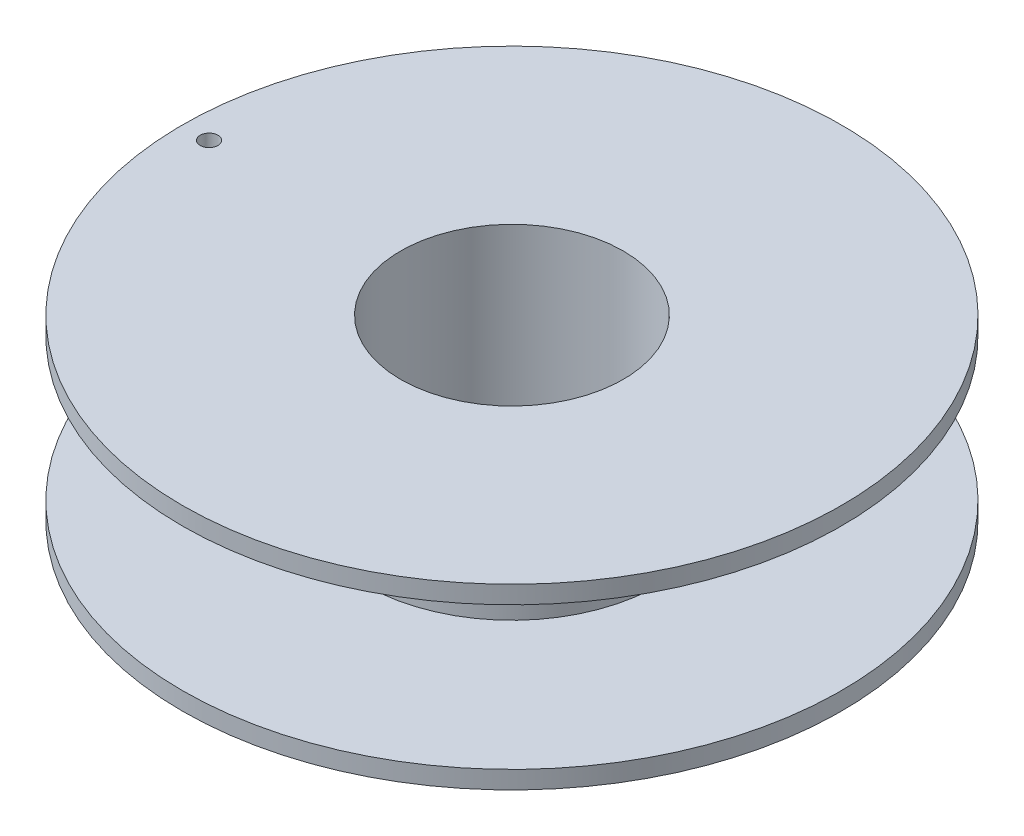
ISO-10303-21;
HEADER;
FILE_DESCRIPTION(('STEP AP214'),'2;1');
FILE_NAME('part.step','',(''),(''),'','','');
FILE_SCHEMA(('AUTOMOTIVE_DESIGN { 1 0 10303 214 1 1 1 1 }'));
ENDSEC;
DATA;
#1=APPLICATION_CONTEXT('core data for automotive mechanical design processes');
#2=APPLICATION_PROTOCOL_DEFINITION('international standard','automotive_design',2000,#1);
#3=PRODUCT_CONTEXT('',#1,'mechanical');
#4=PRODUCT('Part','Part','',(#3));
#5=PRODUCT_RELATED_PRODUCT_CATEGORY('part','',(#4));
#6=PRODUCT_DEFINITION_FORMATION('','',#4);
#7=PRODUCT_DEFINITION_CONTEXT('part definition',#1,'design');
#8=PRODUCT_DEFINITION('design','',#6,#7);
#9=PRODUCT_DEFINITION_SHAPE('','',#8);
#10=(LENGTH_UNIT() NAMED_UNIT(*) SI_UNIT(.MILLI.,.METRE.));
#11=(NAMED_UNIT(*) PLANE_ANGLE_UNIT() SI_UNIT($,.RADIAN.));
#12=(NAMED_UNIT(*) SI_UNIT($,.STERADIAN.) SOLID_ANGLE_UNIT());
#13=UNCERTAINTY_MEASURE_WITH_UNIT(LENGTH_MEASURE(1.E-05),#10,'distance_accuracy_value','');
#14=(GEOMETRIC_REPRESENTATION_CONTEXT(3) GLOBAL_UNCERTAINTY_ASSIGNED_CONTEXT((#13)) GLOBAL_UNIT_ASSIGNED_CONTEXT((#10,
#11,#12)) REPRESENTATION_CONTEXT('',''));
#15=CARTESIAN_POINT('',(0.,0.,0.));
#16=DIRECTION('',(0.,0.,1.));
#17=DIRECTION('',(1.,0.,0.));
#18=AXIS2_PLACEMENT_3D('',#15,#16,#17);
#19=CARTESIAN_POINT('',(0.,5.,0.));
#20=DIRECTION('',(0.,-1.,0.));
#21=DIRECTION('',(0.,0.,-1.));
#22=AXIS2_PLACEMENT_3D('',#19,#20,#21);
#23=CYLINDRICAL_SURFACE('',#22,18.5);
#24=CARTESIAN_POINT('',(0.,-5.,0.));
#25=DIRECTION('',(0.,1.,0.));
#26=DIRECTION('',(0.,0.,1.));
#27=AXIS2_PLACEMENT_3D('',#24,#25,#26);
#28=CIRCLE('',#27,18.5);
#29=CARTESIAN_POINT('',(0.,-5.,18.5));
#30=VERTEX_POINT('',#29);
#31=EDGE_CURVE('E71',#30,#30,#28,.T.);
#32=ORIENTED_EDGE('',*,*,#31,.T.);
#33=EDGE_LOOP('',(#32));
#34=FACE_BOUND('',#33,.T.);
#35=CARTESIAN_POINT('',(0.,-4.,0.));
#36=DIRECTION('',(0.,1.,0.));
#37=DIRECTION('',(0.,0.,1.));
#38=AXIS2_PLACEMENT_3D('',#35,#36,#37);
#39=CIRCLE('',#38,18.5);
#40=CARTESIAN_POINT('',(0.,-4.,18.5));
#41=VERTEX_POINT('',#40);
#42=EDGE_CURVE('E75',#41,#41,#39,.T.);
#43=ORIENTED_EDGE('',*,*,#42,.F.);
#44=EDGE_LOOP('',(#43));
#45=FACE_BOUND('',#44,.T.);
#46=ADVANCED_FACE('F49',(#34,#45),#23,.T.);
#47=CARTESIAN_POINT('',(0.,5.,0.));
#48=DIRECTION('',(0.,1.,0.));
#49=DIRECTION('',(0.,0.,1.));
#50=AXIS2_PLACEMENT_3D('',#47,#48,#49);
#51=PLANE('',#50);
#52=CARTESIAN_POINT('',(-17.,5.,0.));
#53=DIRECTION('',(0.,1.,0.));
#54=DIRECTION('',(0.,0.,1.));
#55=AXIS2_PLACEMENT_3D('',#52,#53,#54);
#56=CIRCLE('',#55,0.499999999999999);
#57=CARTESIAN_POINT('',(-17.,5.,0.499999999999999));
#58=VERTEX_POINT('',#57);
#59=EDGE_CURVE('E210',#58,#58,#56,.T.);
#60=ORIENTED_EDGE('',*,*,#59,.F.);
#61=EDGE_LOOP('',(#60));
#62=FACE_BOUND('',#61,.T.);
#63=CARTESIAN_POINT('',(0.,5.,0.));
#64=DIRECTION('',(0.,1.,0.));
#65=DIRECTION('',(0.,0.,1.));
#66=AXIS2_PLACEMENT_3D('',#63,#64,#65);
#67=CIRCLE('',#66,6.25);
#68=CARTESIAN_POINT('',(0.,5.,6.25));
#69=VERTEX_POINT('',#68);
#70=EDGE_CURVE('E11',#69,#69,#67,.T.);
#71=ORIENTED_EDGE('',*,*,#70,.F.);
#72=EDGE_LOOP('',(#71));
#73=FACE_BOUND('',#72,.T.);
#74=CARTESIAN_POINT('',(0.,5.,0.));
#75=DIRECTION('',(0.,1.,0.));
#76=DIRECTION('',(0.,0.,1.));
#77=AXIS2_PLACEMENT_3D('',#74,#75,#76);
#78=CIRCLE('',#77,18.5);
#79=CARTESIAN_POINT('',(0.,5.,18.5));
#80=VERTEX_POINT('',#79);
#81=EDGE_CURVE('E69',#80,#80,#78,.T.);
#82=ORIENTED_EDGE('',*,*,#81,.T.);
#83=EDGE_LOOP('',(#82));
#84=FACE_BOUND('',#83,.T.);
#85=ADVANCED_FACE('F135',(#62,#73,#84),#51,.T.);
#86=CARTESIAN_POINT('',(0.,-5.,0.));
#87=DIRECTION('',(0.,1.,0.));
#88=DIRECTION('',(0.,0.,1.));
#89=AXIS2_PLACEMENT_3D('',#86,#87,#88);
#90=PLANE('',#89);
#91=CARTESIAN_POINT('',(0.,-5.,0.));
#92=DIRECTION('',(0.,1.,0.));
#93=DIRECTION('',(0.,0.,1.));
#94=AXIS2_PLACEMENT_3D('',#91,#92,#93);
#95=CIRCLE('',#94,6.25);
#96=CARTESIAN_POINT('',(0.,-5.,6.25));
#97=VERTEX_POINT('',#96);
#98=EDGE_CURVE('E63',#97,#97,#95,.T.);
#99=ORIENTED_EDGE('',*,*,#98,.T.);
#100=EDGE_LOOP('',(#99));
#101=FACE_BOUND('',#100,.T.);
#102=ORIENTED_EDGE('',*,*,#31,.F.);
#103=EDGE_LOOP('',(#102));
#104=FACE_BOUND('',#103,.T.);
#105=ADVANCED_FACE('F51',(#101,#104),#90,.F.);
#106=CARTESIAN_POINT('',(0.,5.,0.));
#107=DIRECTION('',(0.,-1.,0.));
#108=DIRECTION('',(0.,0.,-1.));
#109=AXIS2_PLACEMENT_3D('',#106,#107,#108);
#110=CYLINDRICAL_SURFACE('',#109,6.25);
#111=CARTESIAN_POINT('',(-6.22996789718856,-3.25,-0.5));
#112=CARTESIAN_POINT('',(-6.22996816306714,-3.22196303658145,-0.499998773542574));
#113=CARTESIAN_POINT('',(-6.23015919807194,-3.19390688840206,-0.49763385405061));
#114=CARTESIAN_POINT('',(-6.23090270689278,-3.13857058589619,-0.48823439591462));
#115=CARTESIAN_POINT('',(-6.23145559223873,-3.11129135205477,-0.481194540363886));
#116=CARTESIAN_POINT('',(-6.23285978174021,-3.0583183604555,-0.462649863412873));
#117=CARTESIAN_POINT('',(-6.23371091877855,-3.03262372427355,-0.451147542047522));
#118=CARTESIAN_POINT('',(-6.23561550016669,-2.98353607308615,-0.424008820142775));
#119=CARTESIAN_POINT('',(-6.23666890070279,-2.96014256127466,-0.408373314645551));
#120=CARTESIAN_POINT('',(-6.23886213054385,-2.91625939722945,-0.373371839438295));
#121=CARTESIAN_POINT('',(-6.24000213718694,-2.89577596395828,-0.35399808311016));
#122=CARTESIAN_POINT('',(-6.24223850113019,-2.85834780486697,-0.312086481920115));
#123=CARTESIAN_POINT('',(-6.24333485653735,-2.84140323237849,-0.289548500029465));
#124=CARTESIAN_POINT('',(-6.24536204844526,-2.81151330824247,-0.241911389491982));
#125=CARTESIAN_POINT('',(-6.24629266283267,-2.79857330634422,-0.216808893885029));
#126=CARTESIAN_POINT('',(-6.24788161195972,-2.77709406483419,-0.164778830362962));
#127=CARTESIAN_POINT('',(-6.24853995113268,-2.76855475356757,-0.137851292172427));
#128=CARTESIAN_POINT('',(-6.24950893515625,-2.75613710920112,-0.0829971652536232));
#129=CARTESIAN_POINT('',(-6.24982032743247,-2.75224875523682,-0.0550728584174532));
#130=CARTESIAN_POINT('',(-6.25006286267279,-2.74921242915897,0.00103367140840682));
#131=CARTESIAN_POINT('',(-6.2499940122099,-2.75006437510308,0.0292158899313453));
#132=CARTESIAN_POINT('',(-6.2494844374062,-2.75647625805381,0.0849703196152468));
#133=CARTESIAN_POINT('',(-6.24904456427285,-2.76202541872212,0.112543778940195));
#134=CARTESIAN_POINT('',(-6.24784340724612,-2.77765746043004,0.166366650063271));
#135=CARTESIAN_POINT('',(-6.24708212049865,-2.78774038172853,0.19261605010172));
#136=CARTESIAN_POINT('',(-6.2453223291046,-2.81216577260722,0.243080025209537));
#137=CARTESIAN_POINT('',(-6.24432355536642,-2.82651307871813,0.267292249555116));
#138=CARTESIAN_POINT('',(-6.24220106030109,-2.85905645937733,0.312968918129877));
#139=CARTESIAN_POINT('',(-6.24107733664156,-2.87725260577573,0.334433311050561));
#140=CARTESIAN_POINT('',(-6.23882754627833,-2.91703790406557,0.374068009742349));
#141=CARTESIAN_POINT('',(-6.23770148182926,-2.93863641801694,0.392228919325154));
#142=CARTESIAN_POINT('',(-6.23557709693072,-2.98458069163395,0.424668563472137));
#143=CARTESIAN_POINT('',(-6.23457877657497,-3.0089264533151,0.438947295188147));
#144=CARTESIAN_POINT('',(-6.23282271114982,-3.05968062143112,0.463216849547181));
#145=CARTESIAN_POINT('',(-6.23206499251755,-3.08608925413579,0.473207201028535));
#146=CARTESIAN_POINT('',(-6.23087641674785,-3.14021644637714,0.488609533297522));
#147=CARTESIAN_POINT('',(-6.23044555328412,-3.16793498054959,0.494021602698238));
#148=CARTESIAN_POINT('',(-6.2299604793585,-3.22381297412383,0.500101880928765));
#149=CARTESIAN_POINT('',(-6.22990522914103,-3.2519709999057,0.500783185359857));
#150=CARTESIAN_POINT('',(-6.23017489206967,-3.30800087368211,0.497416881950574));
#151=CARTESIAN_POINT('',(-6.23049980195186,-3.33587272413159,0.493369314710693));
#152=CARTESIAN_POINT('',(-6.23149222671915,-3.3905015736714,0.48067107388006));
#153=CARTESIAN_POINT('',(-6.23215928776625,-3.41725999893395,0.472026497322481));
#154=CARTESIAN_POINT('',(-6.23376047447011,-3.46894657471188,0.450385819634327));
#155=CARTESIAN_POINT('',(-6.23469460408122,-3.49387469812008,0.437389654071605));
#156=CARTESIAN_POINT('',(-6.23672719409702,-3.541253019821,0.407381515689885));
#157=CARTESIAN_POINT('',(-6.23782601002653,-3.5636976699534,0.39036080760526));
#158=CARTESIAN_POINT('',(-6.24006295192615,-3.6054158826374,0.35279937280005));
#159=CARTESIAN_POINT('',(-6.24120107851993,-3.6246893948493,0.332258590211207));
#160=CARTESIAN_POINT('',(-6.24339148866742,-3.65956284416888,0.288183534087863));
#161=CARTESIAN_POINT('',(-6.24444356994137,-3.67515427884132,0.26464252175105));
#162=CARTESIAN_POINT('',(-6.24634043453592,-3.70216267997386,0.215268880255269));
#163=CARTESIAN_POINT('',(-6.24718521978798,-3.71357968532899,0.189436272450921));
#164=CARTESIAN_POINT('',(-6.2485713716254,-3.73190050516322,0.136243340826727));
#165=CARTESIAN_POINT('',(-6.24911309305983,-3.73880959941437,0.108884845095535));
#166=CARTESIAN_POINT('',(-6.24983351662561,-3.74793573334395,0.0533916112397321));
#167=CARTESIAN_POINT('',(-6.25001222503611,-3.75015285418108,0.0252568865503517));
#168=CARTESIAN_POINT('',(-6.24998649856438,-3.74983119080662,-0.0309062955507021));
#169=CARTESIAN_POINT('',(-6.24978313194957,-3.74730566686078,-0.0589348303530609));
#170=CARTESIAN_POINT('',(-6.24901822214291,-3.73759802844628,-0.114168349775254));
#171=CARTESIAN_POINT('',(-6.24845667843436,-3.73041590726016,-0.141373333207));
#172=CARTESIAN_POINT('',(-6.24703843880508,-3.71160225870608,-0.194188546316146));
#173=CARTESIAN_POINT('',(-6.2461817567539,-3.6999709404181,-0.219798850866133));
#174=CARTESIAN_POINT('',(-6.24426914318505,-3.67259062384267,-0.268705311423829));
#175=CARTESIAN_POINT('',(-6.24321321517674,-3.65684169807768,-0.292001508179399));
#176=CARTESIAN_POINT('',(-6.24101716021772,-3.62162349928902,-0.335686266287128));
#177=CARTESIAN_POINT('',(-6.23987681666073,-3.60214443655734,-0.35606692431178));
#178=CARTESIAN_POINT('',(-6.2376422901212,-3.56003609738647,-0.393277416065554));
#179=CARTESIAN_POINT('',(-6.23654811840499,-3.53740605780694,-0.410106387114271));
#180=CARTESIAN_POINT('',(-6.23452772800491,-3.48959751637774,-0.439756682068028));
#181=CARTESIAN_POINT('',(-6.23360180795672,-3.46441460437674,-0.452570908692581));
#182=CARTESIAN_POINT('',(-6.23202642504996,-3.4122646258933,-0.473772850667595));
#183=CARTESIAN_POINT('',(-6.23137664344914,-3.38529965819985,-0.482165672273664));
#184=CARTESIAN_POINT('',(-6.23059479245368,-3.34014543397942,-0.492141126527205));
#185=CARTESIAN_POINT('',(-6.23036078196813,-3.32224686618042,-0.495084305775903));
#186=CARTESIAN_POINT('',(-6.23004724859996,-3.28623487009299,-0.499014136479751));
#187=CARTESIAN_POINT('',(-6.2299677253403,-3.26812144232906,-0.500000792709866));
#188=CARTESIAN_POINT('',(-6.22996789718856,-3.25,-0.5));
#189=B_SPLINE_CURVE_WITH_KNOTS('',3,(#111,#112,#113,#114,#115,#116,#117,#118,#119,#120,#121,
#122,#123,#124,#125,#126,#127,#128,#129,#130,#131,#132,#133,#134,#135,#136,#137,#138,#139,#140,
#141,#142,#143,#144,#145,#146,#147,#148,#149,#150,#151,#152,#153,#154,#155,#156,#157,#158,#159,
#160,#161,#162,#163,#164,#165,#166,#167,#168,#169,#170,#171,#172,#173,#174,#175,#176,#177,#178,
#179,#180,#181,#182,#183,#184,#185,#186,#187,#188),.UNSPECIFIED.,.T.,.F.,(4,2,2,2,2,2,2,2,2,2,2,
2,2,2,2,2,2,2,2,2,2,2,2,2,2,2,2,2,2,2,2,2,2,2,2,2,2,2,4),(0.,0.0840447273459697,
0.168185204674616,0.252278611373576,0.336353822518611,0.42060608705634,0.504862001316423,
0.589229992865501,0.673596610638056,0.757781124365621,0.841964182857269,0.925954630602646,
1.00994582418074,1.09403264380004,1.17812103328978,1.2624449801965,1.3467689889675,
1.43110225999506,1.51543389870686,1.59953199900154,1.68362937726366,1.76761549398539,
1.85160285430918,1.9357742101439,2.01994690201358,2.10431210044065,2.18867651277898,
2.2729419373017,2.35720590424409,2.44123462285517,2.52526346268373,2.60928835425165,
2.69331176600872,2.77755879596979,2.86182626546537,2.94624187356268,3.03055977563551,
3.08488147138778,3.13920303456585),.UNSPECIFIED.);
#190=CARTESIAN_POINT('',(-6.22996789718856,-3.25,-0.5));
#191=VERTEX_POINT('',#190);
#192=EDGE_CURVE('E88',#191,#191,#189,.T.);
#193=ORIENTED_EDGE('',*,*,#192,.F.);
#194=EDGE_LOOP('',(#193));
#195=FACE_BOUND('',#194,.T.);
#196=ORIENTED_EDGE('',*,*,#70,.T.);
#197=EDGE_LOOP('',(#196));
#198=FACE_BOUND('',#197,.T.);
#199=ORIENTED_EDGE('',*,*,#98,.F.);
#200=EDGE_LOOP('',(#199));
#201=FACE_BOUND('',#200,.T.);
#202=ADVANCED_FACE('F104',(#195,#198,#201),#110,.F.);
#203=CARTESIAN_POINT('',(0.,4.,0.));
#204=DIRECTION('',(0.,1.,0.));
#205=DIRECTION('',(0.,0.,1.));
#206=AXIS2_PLACEMENT_3D('',#203,#204,#205);
#207=CIRCLE('',#206,18.5);
#208=CARTESIAN_POINT('',(0.,4.,18.5));
#209=VERTEX_POINT('',#208);
#210=EDGE_CURVE('E79',#209,#209,#207,.T.);
#211=ORIENTED_EDGE('',*,*,#210,.T.);
#212=EDGE_LOOP('',(#211));
#213=FACE_BOUND('',#212,.T.);
#214=ORIENTED_EDGE('',*,*,#81,.F.);
#215=EDGE_LOOP('',(#214));
#216=FACE_BOUND('',#215,.T.);
#217=ADVANCED_FACE('F125',(#213,#216),#23,.T.);
#218=CARTESIAN_POINT('',(0.,-4.,0.));
#219=DIRECTION('',(0.,1.,0.));
#220=DIRECTION('',(0.,0.,1.));
#221=AXIS2_PLACEMENT_3D('',#218,#219,#220);
#222=CYLINDRICAL_SURFACE('',#221,8.25);
#223=CARTESIAN_POINT('',(-8.2348345460003,-3.25,-0.5));
#224=CARTESIAN_POINT('',(-8.23483474902233,-3.27805753463555,-0.499998764780337));
#225=CARTESIAN_POINT('',(-8.23497948338303,-3.30613475696716,-0.497630388632744));
#226=CARTESIAN_POINT('',(-8.23554285568618,-3.3615140403878,-0.48821639650865));
#227=CARTESIAN_POINT('',(-8.23596181308199,-3.38881515861024,-0.481165325333351));
#228=CARTESIAN_POINT('',(-8.23702600230368,-3.44183203389453,-0.462589110238093));
#229=CARTESIAN_POINT('',(-8.23767111535113,-3.46754861484582,-0.451066314558033));
#230=CARTESIAN_POINT('',(-8.23911477597956,-3.51667582507444,-0.423877507502146));
#231=CARTESIAN_POINT('',(-8.23991328823586,-3.54008698336944,-0.408212449692117));
#232=CARTESIAN_POINT('',(-8.24157505928652,-3.58397884044444,-0.373159323966862));
#233=CARTESIAN_POINT('',(-8.24243839793404,-3.6044558315831,-0.353766616922186));
#234=CARTESIAN_POINT('',(-8.24413179833724,-3.64186637491958,-0.311818211693701));
#235=CARTESIAN_POINT('',(-8.24496185870872,-3.65879977984698,-0.289262382116467));
#236=CARTESIAN_POINT('',(-8.24649584838526,-3.68865364440411,-0.241607370409431));
#237=CARTESIAN_POINT('',(-8.24719968221152,-3.70157107168776,-0.216506285305091));
#238=CARTESIAN_POINT('',(-8.24840107638284,-3.72300687893047,-0.16448664537857));
#239=CARTESIAN_POINT('',(-8.24889863882843,-3.73152530368634,-0.137568109067383));
#240=CARTESIAN_POINT('',(-8.24963087732223,-3.74391110857159,-0.0827130904512008));
#241=CARTESIAN_POINT('',(-8.24986587870321,-3.74778424499867,-0.0547779122812448));
#242=CARTESIAN_POINT('',(-8.2500476100794,-3.75078730341642,0.00134699710876346));
#243=CARTESIAN_POINT('',(-8.2499943431614,-3.74991727619741,0.0295367255998363));
#244=CARTESIAN_POINT('',(-8.24960581202844,-3.74346345734223,0.0853315448560264));
#245=CARTESIAN_POINT('',(-8.24927091829087,-3.73788585843666,0.112937354875078));
#246=CARTESIAN_POINT('',(-8.24835726671782,-3.72218483203032,0.166820163891383));
#247=CARTESIAN_POINT('',(-8.2477785075097,-3.71206137894256,0.193097155408268));
#248=CARTESIAN_POINT('',(-8.24644165652179,-3.68754899151331,0.243596308842819));
#249=CARTESIAN_POINT('',(-8.24568344671361,-3.67315724824513,0.267817104051105));
#250=CARTESIAN_POINT('',(-8.2440730342053,-3.64051885414933,0.313501397626353));
#251=CARTESIAN_POINT('',(-8.24322083051276,-3.62227216261883,0.334964866875952));
#252=CARTESIAN_POINT('',(-8.24151673214639,-3.58240684778213,0.374561379504433));
#253=CARTESIAN_POINT('',(-8.24066484017278,-3.56078284979537,0.39268901227247));
#254=CARTESIAN_POINT('',(-8.23905877818571,-3.5147955868284,0.425057564176335));
#255=CARTESIAN_POINT('',(-8.23830460820873,-3.49043232082591,0.439298481861657));
#256=CARTESIAN_POINT('',(-8.23697914781703,-3.43965469535594,0.463488956305663));
#257=CARTESIAN_POINT('',(-8.23640786694211,-3.41324022898379,0.473438289217738));
#258=CARTESIAN_POINT('',(-8.23551295319896,-3.3591115726007,0.488759453543135));
#259=CARTESIAN_POINT('',(-8.23518931759211,-3.3313973969663,0.49413133557667));
#260=CARTESIAN_POINT('',(-8.23482670357445,-3.2755032113706,0.500138377287646));
#261=CARTESIAN_POINT('',(-8.23478727329628,-3.24732401230752,0.500781056114167));
#262=CARTESIAN_POINT('',(-8.23499633624633,-3.19125820636308,0.497331089957923));
#263=CARTESIAN_POINT('',(-8.23524482806707,-3.16337159805209,0.493238468123287));
#264=CARTESIAN_POINT('',(-8.23600131844632,-3.10870381185894,0.480440319595857));
#265=CARTESIAN_POINT('',(-8.23650912237875,-3.08192182117852,0.471738252328732));
#266=CARTESIAN_POINT('',(-8.23772684466395,-3.03019843353743,0.449971736332927));
#267=CARTESIAN_POINT('',(-8.23843676474016,-3.00525705227384,0.436907250405917));
#268=CARTESIAN_POINT('',(-8.23997981201962,-2.95788833025351,0.406767521619706));
#269=CARTESIAN_POINT('',(-8.24081309356569,-2.9354642016431,0.389687238448487));
#270=CARTESIAN_POINT('',(-8.2425084170476,-2.89379887403768,0.352008102210361));
#271=CARTESIAN_POINT('',(-8.24337045924874,-2.87455770441528,0.331409216677052));
#272=CARTESIAN_POINT('',(-8.24502748131923,-2.8397791047472,0.287245252205956));
#273=CARTESIAN_POINT('',(-8.24582237223913,-2.82424653895621,0.26367633893535));
#274=CARTESIAN_POINT('',(-8.24725424288127,-2.79735933996041,0.214260652776224));
#275=CARTESIAN_POINT('',(-8.24789122353027,-2.786004682236,0.188413893257196));
#276=CARTESIAN_POINT('',(-8.24893507276655,-2.76780408474914,0.135194127265181));
#277=CARTESIAN_POINT('',(-8.24934209872957,-2.76095506090448,0.107822178725418));
#278=CARTESIAN_POINT('',(-8.24988080142263,-2.75195005567891,0.0523142978596576));
#279=CARTESIAN_POINT('',(-8.25001248066999,-2.74979403139275,0.0241783725206186));
#280=CARTESIAN_POINT('',(-8.24998566047597,-2.75023664011806,-0.0320106183496175));
#281=CARTESIAN_POINT('',(-8.24982762580289,-2.75282765776948,-0.0600637444080201));
#282=CARTESIAN_POINT('',(-8.24924007449708,-2.76267501920378,-0.115335859221016));
#283=CARTESIAN_POINT('',(-8.24881055738068,-2.76993137129805,-0.142554846489482));
#284=CARTESIAN_POINT('',(-8.24772832624774,-2.78890172582566,-0.195387250518502));
#285=CARTESIAN_POINT('',(-8.24707561319338,-2.80061570904249,-0.221000674199968));
#286=CARTESIAN_POINT('',(-8.24562029501641,-2.82816771609484,-0.269898174530649));
#287=CARTESIAN_POINT('',(-8.24481769389979,-2.84400562971656,-0.293182313407978));
#288=CARTESIAN_POINT('',(-8.24315136684315,-2.87938394922261,-0.336798841670278));
#289=CARTESIAN_POINT('',(-8.2422875516371,-2.89892983490932,-0.357126782701226));
#290=CARTESIAN_POINT('',(-8.24059685241701,-2.94116238606343,-0.394219823843733));
#291=CARTESIAN_POINT('',(-8.23976997750093,-2.96384981967908,-0.410984050032564));
#292=CARTESIAN_POINT('',(-8.23824567078938,-3.01174603734482,-0.440485442526481));
#293=CARTESIAN_POINT('',(-8.23754839473672,-3.03695779971038,-0.453217776346974));
#294=CARTESIAN_POINT('',(-8.23636424349697,-3.0891470127913,-0.474253189161563));
#295=CARTESIAN_POINT('',(-8.23587712166124,-3.11612235060296,-0.482561463176241));
#296=CARTESIAN_POINT('',(-8.23529627768673,-3.16105262799486,-0.492350212422221));
#297=CARTESIAN_POINT('',(-8.23512390036569,-3.17871703590329,-0.495215181022194));
#298=CARTESIAN_POINT('',(-8.23489296991396,-3.21425163151877,-0.499040467111924));
#299=CARTESIAN_POINT('',(-8.23483441663524,-3.23212181895819,-0.500000787078446));
#300=CARTESIAN_POINT('',(-8.2348345460003,-3.25,-0.5));
#301=B_SPLINE_CURVE_WITH_KNOTS('',3,(#223,#224,#225,#226,#227,#228,#229,#230,#231,#232,#233,
#234,#235,#236,#237,#238,#239,#240,#241,#242,#243,#244,#245,#246,#247,#248,#249,#250,#251,#252,
#253,#254,#255,#256,#257,#258,#259,#260,#261,#262,#263,#264,#265,#266,#267,#268,#269,#270,#271,
#272,#273,#274,#275,#276,#277,#278,#279,#280,#281,#282,#283,#284,#285,#286,#287,#288,#289,#290,
#291,#292,#293,#294,#295,#296,#297,#298,#299,#300),.UNSPECIFIED.,.T.,.F.,(4,2,2,2,2,2,2,2,2,2,2,
2,2,2,2,2,2,2,2,2,2,2,2,2,2,2,2,2,2,2,2,2,2,2,2,2,2,2,4),(0.,0.0841073381062147,
0.168312831013197,0.25247416473445,0.336616141011557,0.420863519594246,0.505114398778749,
0.589428739672087,0.673742221941668,0.757951117245722,0.842159110833599,0.926256502578803,
1.01035436768401,1.09450770017464,1.17866192125148,1.26295145708564,1.34724102437622,
1.43153498763095,1.51582801870006,1.59998699989604,1.68414556968947,1.76824106710879,
1.85233728162846,1.93653961592708,2.02074272720879,2.10505568107518,2.18936814011171,
2.2736228275072,2.35787674460994,2.44199561715472,2.52611463955943,2.61023329933728,
2.69434971123879,2.77859141633795,2.86285375609281,2.94721671078723,3.03148038128892,
3.08507340692377,3.1386663628673),.UNSPECIFIED.);
#302=CARTESIAN_POINT('',(-8.2348345460003,-3.25,-0.5));
#303=VERTEX_POINT('',#302);
#304=EDGE_CURVE('E53',#303,#303,#301,.T.);
#305=ORIENTED_EDGE('',*,*,#304,.F.);
#306=EDGE_LOOP('',(#305));
#307=FACE_BOUND('',#306,.T.);
#308=CARTESIAN_POINT('',(0.,-4.,0.));
#309=DIRECTION('',(0.,1.,0.));
#310=DIRECTION('',(0.,0.,1.));
#311=AXIS2_PLACEMENT_3D('',#308,#309,#310);
#312=CIRCLE('',#311,8.25);
#313=CARTESIAN_POINT('',(0.,-4.,8.25));
#314=VERTEX_POINT('',#313);
#315=EDGE_CURVE('E83',#314,#314,#312,.T.);
#316=ORIENTED_EDGE('',*,*,#315,.T.);
#317=EDGE_LOOP('',(#316));
#318=FACE_BOUND('',#317,.T.);
#319=CARTESIAN_POINT('',(0.,4.,0.));
#320=DIRECTION('',(0.,1.,0.));
#321=DIRECTION('',(0.,0.,1.));
#322=AXIS2_PLACEMENT_3D('',#319,#320,#321);
#323=CIRCLE('',#322,8.25);
#324=CARTESIAN_POINT('',(0.,4.,8.25));
#325=VERTEX_POINT('',#324);
#326=EDGE_CURVE('E84',#325,#325,#323,.T.);
#327=ORIENTED_EDGE('',*,*,#326,.F.);
#328=EDGE_LOOP('',(#327));
#329=FACE_BOUND('',#328,.T.);
#330=ADVANCED_FACE('F119',(#307,#318,#329),#222,.T.);
#331=CARTESIAN_POINT('',(0.,-4.,0.));
#332=DIRECTION('',(0.,1.,0.));
#333=DIRECTION('',(0.,0.,1.));
#334=AXIS2_PLACEMENT_3D('',#331,#332,#333);
#335=PLANE('',#334);
#336=ORIENTED_EDGE('',*,*,#315,.F.);
#337=EDGE_LOOP('',(#336));
#338=FACE_BOUND('',#337,.T.);
#339=ORIENTED_EDGE('',*,*,#42,.T.);
#340=EDGE_LOOP('',(#339));
#341=FACE_BOUND('',#340,.T.);
#342=ADVANCED_FACE('F115',(#338,#341),#335,.T.);
#343=CARTESIAN_POINT('',(0.,4.,0.));
#344=DIRECTION('',(0.,1.,0.));
#345=DIRECTION('',(0.,0.,1.));
#346=AXIS2_PLACEMENT_3D('',#343,#344,#345);
#347=PLANE('',#346);
#348=CARTESIAN_POINT('',(-17.,4.,0.));
#349=DIRECTION('',(0.,1.,0.));
#350=DIRECTION('',(0.,0.,1.));
#351=AXIS2_PLACEMENT_3D('',#348,#349,#350);
#352=CIRCLE('',#351,0.499999999999999);
#353=CARTESIAN_POINT('',(-17.,4.,0.499999999999999));
#354=VERTEX_POINT('',#353);
#355=EDGE_CURVE('E102',#354,#354,#352,.F.);
#356=ORIENTED_EDGE('',*,*,#355,.F.);
#357=EDGE_LOOP('',(#356));
#358=FACE_BOUND('',#357,.T.);
#359=ORIENTED_EDGE('',*,*,#326,.T.);
#360=EDGE_LOOP('',(#359));
#361=FACE_BOUND('',#360,.T.);
#362=ORIENTED_EDGE('',*,*,#210,.F.);
#363=EDGE_LOOP('',(#362));
#364=FACE_BOUND('',#363,.T.);
#365=ADVANCED_FACE('F113',(#358,#361,#364),#347,.F.);
#366=CARTESIAN_POINT('',(-18.5,-3.25,0.));
#367=DIRECTION('',(1.,0.,0.));
#368=DIRECTION('',(0.,0.,-1.));
#369=AXIS2_PLACEMENT_3D('',#366,#367,#368);
#370=CYLINDRICAL_SURFACE('',#369,0.5);
#371=ORIENTED_EDGE('',*,*,#192,.T.);
#372=EDGE_LOOP('',(#371));
#373=FACE_BOUND('',#372,.T.);
#374=ORIENTED_EDGE('',*,*,#304,.T.);
#375=EDGE_LOOP('',(#374));
#376=FACE_BOUND('',#375,.T.);
#377=ADVANCED_FACE('F107',(#373,#376),#370,.F.);
#378=CARTESIAN_POINT('',(-17.,-5.001,0.));
#379=DIRECTION('',(0.,1.,0.));
#380=DIRECTION('',(0.,0.,1.));
#381=AXIS2_PLACEMENT_3D('',#378,#379,#380);
#382=CYLINDRICAL_SURFACE('',#381,0.499999999999999);
#383=ORIENTED_EDGE('',*,*,#59,.T.);
#384=EDGE_LOOP('',(#383));
#385=FACE_BOUND('',#384,.T.);
#386=ORIENTED_EDGE('',*,*,#355,.T.);
#387=EDGE_LOOP('',(#386));
#388=FACE_BOUND('',#387,.T.);
#389=ADVANCED_FACE('F112',(#385,#388),#382,.F.);
#390=CLOSED_SHELL('',(#46,#85,#105,#202,#217,#330,#342,#365,#377,#389));
#391=MANIFOLD_SOLID_BREP('B2',#390);
#392=ADVANCED_BREP_SHAPE_REPRESENTATION('',(#18,#391),#14);
#393=SHAPE_DEFINITION_REPRESENTATION(#9,#392);
ENDSEC;
END-ISO-10303-21;
